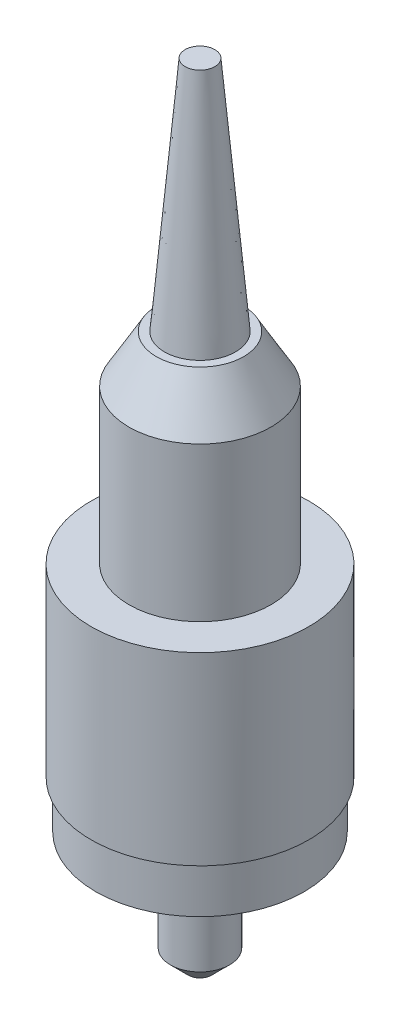
ISO-10303-21;
HEADER;
FILE_DESCRIPTION(('STEP AP214'),'2;1');
FILE_NAME('part.step','',(''),(''),'','','');
FILE_SCHEMA(('AUTOMOTIVE_DESIGN { 1 0 10303 214 1 1 1 1 }'));
ENDSEC;
DATA;
#1=APPLICATION_CONTEXT('core data for automotive mechanical design processes');
#2=APPLICATION_PROTOCOL_DEFINITION('international standard','automotive_design',2000,#1);
#3=PRODUCT_CONTEXT('',#1,'mechanical');
#4=PRODUCT('Part','Part','',(#3));
#5=PRODUCT_RELATED_PRODUCT_CATEGORY('part','',(#4));
#6=PRODUCT_DEFINITION_FORMATION('','',#4);
#7=PRODUCT_DEFINITION_CONTEXT('part definition',#1,'design');
#8=PRODUCT_DEFINITION('design','',#6,#7);
#9=PRODUCT_DEFINITION_SHAPE('','',#8);
#10=(LENGTH_UNIT() NAMED_UNIT(*) SI_UNIT(.MILLI.,.METRE.));
#11=(NAMED_UNIT(*) PLANE_ANGLE_UNIT() SI_UNIT($,.RADIAN.));
#12=(NAMED_UNIT(*) SI_UNIT($,.STERADIAN.) SOLID_ANGLE_UNIT());
#13=UNCERTAINTY_MEASURE_WITH_UNIT(LENGTH_MEASURE(1.E-05),#10,'distance_accuracy_value','');
#14=(GEOMETRIC_REPRESENTATION_CONTEXT(3) GLOBAL_UNCERTAINTY_ASSIGNED_CONTEXT((#13)) GLOBAL_UNIT_ASSIGNED_CONTEXT((#10,
#11,#12)) REPRESENTATION_CONTEXT('',''));
#15=CARTESIAN_POINT('',(0.,0.,0.));
#16=DIRECTION('',(0.,0.,1.));
#17=DIRECTION('',(1.,0.,0.));
#18=AXIS2_PLACEMENT_3D('',#15,#16,#17);
#19=CARTESIAN_POINT('',(0.,18.3,0.));
#20=DIRECTION('',(0.,1.,0.));
#21=DIRECTION('',(0.,0.,1.));
#22=AXIS2_PLACEMENT_3D('',#19,#20,#21);
#23=PLANE('',#22);
#24=CARTESIAN_POINT('',(0.,18.3,0.));
#25=DIRECTION('',(0.,1.,0.));
#26=DIRECTION('',(0.,0.,1.));
#27=AXIS2_PLACEMENT_3D('',#24,#25,#26);
#28=CIRCLE('',#27,1.84529946162074);
#29=CARTESIAN_POINT('',(0.,18.3,1.84529946162074));
#30=VERTEX_POINT('',#29);
#31=EDGE_CURVE('E44',#30,#30,#28,.T.);
#32=ORIENTED_EDGE('',*,*,#31,.T.);
#33=EDGE_LOOP('',(#32));
#34=FACE_BOUND('',#33,.T.);
#35=CARTESIAN_POINT('',(0.,18.3,0.));
#36=DIRECTION('',(0.,1.,0.));
#37=DIRECTION('',(0.,0.,1.));
#38=AXIS2_PLACEMENT_3D('',#35,#36,#37);
#39=CIRCLE('',#38,1.5);
#40=CARTESIAN_POINT('',(0.,18.3,1.5));
#41=VERTEX_POINT('',#40);
#42=EDGE_CURVE('E92',#41,#41,#39,.T.);
#43=ORIENTED_EDGE('',*,*,#42,.F.);
#44=EDGE_LOOP('',(#43));
#45=FACE_BOUND('',#44,.T.);
#46=ADVANCED_FACE('F33',(#34,#45),#23,.T.);
#47=CARTESIAN_POINT('',(0.,9.8,0.));
#48=DIRECTION('',(0.,1.,0.));
#49=DIRECTION('',(0.,0.,1.));
#50=AXIS2_PLACEMENT_3D('',#47,#48,#49);
#51=PLANE('',#50);
#52=CARTESIAN_POINT('',(0.,9.8,0.));
#53=DIRECTION('',(0.,1.,0.));
#54=DIRECTION('',(0.,0.,1.));
#55=AXIS2_PLACEMENT_3D('',#52,#53,#54);
#56=CIRCLE('',#55,4.6);
#57=CARTESIAN_POINT('',(0.,9.8,4.6));
#58=VERTEX_POINT('',#57);
#59=EDGE_CURVE('E56',#58,#58,#56,.T.);
#60=ORIENTED_EDGE('',*,*,#59,.T.);
#61=EDGE_LOOP('',(#60));
#62=FACE_BOUND('',#61,.T.);
#63=CARTESIAN_POINT('',(0.,9.8,0.));
#64=DIRECTION('',(0.,1.,0.));
#65=DIRECTION('',(0.,0.,1.));
#66=AXIS2_PLACEMENT_3D('',#63,#64,#65);
#67=CIRCLE('',#66,3.);
#68=CARTESIAN_POINT('',(0.,9.8,3.));
#69=VERTEX_POINT('',#68);
#70=EDGE_CURVE('E89',#69,#69,#67,.T.);
#71=ORIENTED_EDGE('',*,*,#70,.F.);
#72=EDGE_LOOP('',(#71));
#73=FACE_BOUND('',#72,.T.);
#74=ADVANCED_FACE('F100',(#62,#73),#51,.T.);
#75=CARTESIAN_POINT('',(0.,9.8,0.));
#76=DIRECTION('',(0.,-1.,0.));
#77=DIRECTION('',(0.,0.,-1.));
#78=AXIS2_PLACEMENT_3D('',#75,#76,#77);
#79=CYLINDRICAL_SURFACE('',#78,4.6);
#80=ORIENTED_EDGE('',*,*,#59,.F.);
#81=EDGE_LOOP('',(#80));
#82=FACE_BOUND('',#81,.T.);
#83=CARTESIAN_POINT('',(0.,2.,0.));
#84=DIRECTION('',(0.,-1.,0.));
#85=DIRECTION('',(0.,0.,-1.));
#86=AXIS2_PLACEMENT_3D('',#83,#84,#85);
#87=CIRCLE('',#86,4.6);
#88=CARTESIAN_POINT('',(0.,2.,-4.6));
#89=VERTEX_POINT('',#88);
#90=EDGE_CURVE('E59',#89,#89,#87,.T.);
#91=ORIENTED_EDGE('',*,*,#90,.F.);
#92=EDGE_LOOP('',(#91));
#93=FACE_BOUND('',#92,.T.);
#94=ADVANCED_FACE('F35',(#82,#93),#79,.T.);
#95=CARTESIAN_POINT('',(0.,2.,0.));
#96=DIRECTION('',(0.,-1.,0.));
#97=DIRECTION('',(0.,0.,-1.));
#98=AXIS2_PLACEMENT_3D('',#95,#96,#97);
#99=PLANE('',#98);
#100=CARTESIAN_POINT('',(0.,2.,0.));
#101=DIRECTION('',(0.,-1.,0.));
#102=DIRECTION('',(0.,0.,-1.));
#103=AXIS2_PLACEMENT_3D('',#100,#101,#102);
#104=CIRCLE('',#103,4.4);
#105=CARTESIAN_POINT('',(0.,2.,-4.4));
#106=VERTEX_POINT('',#105);
#107=EDGE_CURVE('E62',#106,#106,#104,.T.);
#108=ORIENTED_EDGE('',*,*,#107,.F.);
#109=EDGE_LOOP('',(#108));
#110=FACE_BOUND('',#109,.T.);
#111=ORIENTED_EDGE('',*,*,#90,.T.);
#112=EDGE_LOOP('',(#111));
#113=FACE_BOUND('',#112,.T.);
#114=ADVANCED_FACE('F154',(#110,#113),#99,.T.);
#115=CARTESIAN_POINT('',(0.,2.,0.));
#116=DIRECTION('',(0.,-1.,0.));
#117=DIRECTION('',(0.,0.,-1.));
#118=AXIS2_PLACEMENT_3D('',#115,#116,#117);
#119=CYLINDRICAL_SURFACE('',#118,4.4);
#120=ORIENTED_EDGE('',*,*,#107,.T.);
#121=EDGE_LOOP('',(#120));
#122=FACE_BOUND('',#121,.T.);
#123=CARTESIAN_POINT('',(0.,0.,0.));
#124=DIRECTION('',(0.,-1.,0.));
#125=DIRECTION('',(0.,0.,-1.));
#126=AXIS2_PLACEMENT_3D('',#123,#124,#125);
#127=CIRCLE('',#126,4.4);
#128=CARTESIAN_POINT('',(0.,0.,-4.4));
#129=VERTEX_POINT('',#128);
#130=EDGE_CURVE('E65',#129,#129,#127,.T.);
#131=ORIENTED_EDGE('',*,*,#130,.F.);
#132=EDGE_LOOP('',(#131));
#133=FACE_BOUND('',#132,.T.);
#134=ADVANCED_FACE('F151',(#122,#133),#119,.T.);
#135=CARTESIAN_POINT('',(0.,0.,0.));
#136=DIRECTION('',(0.,1.,0.));
#137=DIRECTION('',(0.,0.,1.));
#138=AXIS2_PLACEMENT_3D('',#135,#136,#137);
#139=PLANE('',#138);
#140=CARTESIAN_POINT('',(0.,0.,0.));
#141=DIRECTION('',(0.,-1.,0.));
#142=DIRECTION('',(0.,0.,-1.));
#143=AXIS2_PLACEMENT_3D('',#140,#141,#142);
#144=CIRCLE('',#143,3.9);
#145=CARTESIAN_POINT('',(0.,0.,-3.9));
#146=VERTEX_POINT('',#145);
#147=EDGE_CURVE('E71',#146,#146,#144,.T.);
#148=ORIENTED_EDGE('',*,*,#147,.F.);
#149=EDGE_LOOP('',(#148));
#150=FACE_BOUND('',#149,.T.);
#151=ORIENTED_EDGE('',*,*,#130,.T.);
#152=EDGE_LOOP('',(#151));
#153=FACE_BOUND('',#152,.T.);
#154=ADVANCED_FACE('F149',(#150,#153),#139,.F.);
#155=CARTESIAN_POINT('',(0.,4.,0.));
#156=DIRECTION('',(0.,-1.,0.));
#157=DIRECTION('',(0.,0.,-1.));
#158=AXIS2_PLACEMENT_3D('',#155,#156,#157);
#159=CYLINDRICAL_SURFACE('',#158,3.9);
#160=CARTESIAN_POINT('',(0.,4.,0.));
#161=DIRECTION('',(0.,-1.,0.));
#162=DIRECTION('',(0.,0.,-1.));
#163=AXIS2_PLACEMENT_3D('',#160,#161,#162);
#164=CIRCLE('',#163,3.9);
#165=CARTESIAN_POINT('',(0.,4.,-3.9));
#166=VERTEX_POINT('',#165);
#167=EDGE_CURVE('E68',#166,#166,#164,.T.);
#168=ORIENTED_EDGE('',*,*,#167,.F.);
#169=EDGE_LOOP('',(#168));
#170=FACE_BOUND('',#169,.T.);
#171=ORIENTED_EDGE('',*,*,#147,.T.);
#172=EDGE_LOOP('',(#171));
#173=FACE_BOUND('',#172,.T.);
#174=ADVANCED_FACE('F145',(#170,#173),#159,.F.);
#175=CARTESIAN_POINT('',(0.,4.,0.));
#176=DIRECTION('',(0.,-1.,0.));
#177=DIRECTION('',(0.,0.,-1.));
#178=AXIS2_PLACEMENT_3D('',#175,#176,#177);
#179=PLANE('',#178);
#180=CARTESIAN_POINT('',(0.,4.,0.));
#181=DIRECTION('',(0.,-1.,0.));
#182=DIRECTION('',(0.,0.,-1.));
#183=AXIS2_PLACEMENT_3D('',#180,#181,#182);
#184=CIRCLE('',#183,2.9);
#185=CARTESIAN_POINT('',(0.,4.,-2.9));
#186=VERTEX_POINT('',#185);
#187=EDGE_CURVE('E74',#186,#186,#184,.T.);
#188=ORIENTED_EDGE('',*,*,#187,.F.);
#189=EDGE_LOOP('',(#188));
#190=FACE_BOUND('',#189,.T.);
#191=ORIENTED_EDGE('',*,*,#167,.T.);
#192=EDGE_LOOP('',(#191));
#193=FACE_BOUND('',#192,.T.);
#194=ADVANCED_FACE('F141',(#190,#193),#179,.T.);
#195=CARTESIAN_POINT('',(0.,4.,0.));
#196=DIRECTION('',(0.,-1.,0.));
#197=DIRECTION('',(0.,0.,-1.));
#198=AXIS2_PLACEMENT_3D('',#195,#196,#197);
#199=CYLINDRICAL_SURFACE('',#198,2.9);
#200=ORIENTED_EDGE('',*,*,#187,.T.);
#201=EDGE_LOOP('',(#200));
#202=FACE_BOUND('',#201,.T.);
#203=CARTESIAN_POINT('',(0.,-1.,0.));
#204=DIRECTION('',(0.,-1.,0.));
#205=DIRECTION('',(0.,0.,-1.));
#206=AXIS2_PLACEMENT_3D('',#203,#204,#205);
#207=CIRCLE('',#206,2.9);
#208=CARTESIAN_POINT('',(0.,-1.,-2.9));
#209=VERTEX_POINT('',#208);
#210=EDGE_CURVE('E83',#209,#209,#207,.T.);
#211=ORIENTED_EDGE('',*,*,#210,.F.);
#212=EDGE_LOOP('',(#211));
#213=FACE_BOUND('',#212,.T.);
#214=ADVANCED_FACE('F119',(#202,#213),#199,.T.);
#215=CARTESIAN_POINT('',(0.,-1.,0.));
#216=DIRECTION('',(0.,-1.,0.));
#217=DIRECTION('',(0.,0.,-1.));
#218=AXIS2_PLACEMENT_3D('',#215,#216,#217);
#219=PLANE('',#218);
#220=ORIENTED_EDGE('',*,*,#210,.T.);
#221=EDGE_LOOP('',(#220));
#222=FACE_BOUND('',#221,.T.);
#223=CARTESIAN_POINT('',(0.,-1.,0.));
#224=DIRECTION('',(0.,-1.,0.));
#225=DIRECTION('',(0.,0.,-1.));
#226=AXIS2_PLACEMENT_3D('',#223,#224,#225);
#227=CIRCLE('',#226,2.4);
#228=CARTESIAN_POINT('',(0.,-1.,-2.4));
#229=VERTEX_POINT('',#228);
#230=EDGE_CURVE('E86',#229,#229,#227,.T.);
#231=ORIENTED_EDGE('',*,*,#230,.F.);
#232=EDGE_LOOP('',(#231));
#233=FACE_BOUND('',#232,.T.);
#234=ADVANCED_FACE('F115',(#222,#233),#219,.T.);
#235=CARTESIAN_POINT('',(0.,-5.,0.));
#236=DIRECTION('',(0.,-1.,0.));
#237=DIRECTION('',(0.,0.,-1.));
#238=AXIS2_PLACEMENT_3D('',#235,#236,#237);
#239=PLANE('',#238);
#240=CARTESIAN_POINT('',(0.,-5.,0.));
#241=DIRECTION('',(0.,-1.,0.));
#242=DIRECTION('',(0.,0.,-1.));
#243=AXIS2_PLACEMENT_3D('',#240,#241,#242);
#244=CIRCLE('',#243,0.5);
#245=CARTESIAN_POINT('',(0.,-5.,-0.5));
#246=VERTEX_POINT('',#245);
#247=EDGE_CURVE('E53',#246,#246,#244,.T.);
#248=ORIENTED_EDGE('',*,*,#247,.T.);
#249=EDGE_LOOP('',(#248));
#250=FACE_BOUND('',#249,.T.);
#251=ADVANCED_FACE('F118',(#250),#239,.T.);
#252=CARTESIAN_POINT('',(0.,-5.,0.));
#253=DIRECTION('',(0.,1.,0.));
#254=DIRECTION('',(0.,0.,1.));
#255=AXIS2_PLACEMENT_3D('',#252,#253,#254);
#256=CONICAL_SURFACE('',#255,0.5,0.785398163397445);
#257=CARTESIAN_POINT('',(0.,-4.25,0.));
#258=DIRECTION('',(0.,-1.,0.));
#259=DIRECTION('',(0.,0.,-1.));
#260=AXIS2_PLACEMENT_3D('',#257,#258,#259);
#261=CIRCLE('',#260,1.25);
#262=CARTESIAN_POINT('',(0.,-4.25,-1.25));
#263=VERTEX_POINT('',#262);
#264=EDGE_CURVE('E48',#263,#263,#261,.F.);
#265=ORIENTED_EDGE('',*,*,#264,.F.);
#266=EDGE_LOOP('',(#265));
#267=FACE_BOUND('',#266,.T.);
#268=ORIENTED_EDGE('',*,*,#247,.F.);
#269=EDGE_LOOP('',(#268));
#270=FACE_BOUND('',#269,.T.);
#271=ADVANCED_FACE('F121',(#267,#270),#256,.T.);
#272=CARTESIAN_POINT('',(0.,-5.,0.));
#273=DIRECTION('',(0.,1.,0.));
#274=DIRECTION('',(0.,0.,1.));
#275=AXIS2_PLACEMENT_3D('',#272,#273,#274);
#276=CYLINDRICAL_SURFACE('',#275,1.25);
#277=ORIENTED_EDGE('',*,*,#264,.T.);
#278=EDGE_LOOP('',(#277));
#279=FACE_BOUND('',#278,.T.);
#280=CARTESIAN_POINT('',(0.,5.,0.));
#281=DIRECTION('',(0.,-1.,0.));
#282=DIRECTION('',(0.,0.,-1.));
#283=AXIS2_PLACEMENT_3D('',#280,#281,#282);
#284=CIRCLE('',#283,1.25);
#285=CARTESIAN_POINT('',(0.,5.,-1.25));
#286=VERTEX_POINT('',#285);
#287=EDGE_CURVE('E80',#286,#286,#284,.T.);
#288=ORIENTED_EDGE('',*,*,#287,.T.);
#289=EDGE_LOOP('',(#288));
#290=FACE_BOUND('',#289,.T.);
#291=ADVANCED_FACE('F124',(#279,#290),#276,.T.);
#292=CARTESIAN_POINT('',(0.,5.,0.));
#293=DIRECTION('',(0.,-1.,0.));
#294=DIRECTION('',(0.,0.,-1.));
#295=AXIS2_PLACEMENT_3D('',#292,#293,#294);
#296=PLANE('',#295);
#297=CARTESIAN_POINT('',(0.,5.,0.));
#298=DIRECTION('',(0.,-1.,0.));
#299=DIRECTION('',(0.,0.,-1.));
#300=AXIS2_PLACEMENT_3D('',#297,#298,#299);
#301=CIRCLE('',#300,2.4);
#302=CARTESIAN_POINT('',(0.,5.,-2.4));
#303=VERTEX_POINT('',#302);
#304=EDGE_CURVE('E77',#303,#303,#301,.T.);
#305=ORIENTED_EDGE('',*,*,#304,.T.);
#306=EDGE_LOOP('',(#305));
#307=FACE_BOUND('',#306,.T.);
#308=ORIENTED_EDGE('',*,*,#287,.F.);
#309=EDGE_LOOP('',(#308));
#310=FACE_BOUND('',#309,.T.);
#311=ADVANCED_FACE('F131',(#307,#310),#296,.T.);
#312=CARTESIAN_POINT('',(0.,5.,0.));
#313=DIRECTION('',(0.,-1.,0.));
#314=DIRECTION('',(0.,0.,-1.));
#315=AXIS2_PLACEMENT_3D('',#312,#313,#314);
#316=CYLINDRICAL_SURFACE('',#315,2.4);
#317=ORIENTED_EDGE('',*,*,#304,.F.);
#318=EDGE_LOOP('',(#317));
#319=FACE_BOUND('',#318,.T.);
#320=ORIENTED_EDGE('',*,*,#230,.T.);
#321=EDGE_LOOP('',(#320));
#322=FACE_BOUND('',#321,.T.);
#323=ADVANCED_FACE('F114',(#319,#322),#316,.F.);
#324=CARTESIAN_POINT('',(0.,18.3,0.));
#325=DIRECTION('',(0.,-1.,0.));
#326=DIRECTION('',(0.,0.,-1.));
#327=AXIS2_PLACEMENT_3D('',#324,#325,#326);
#328=CYLINDRICAL_SURFACE('',#327,3.);
#329=CARTESIAN_POINT('',(0.,16.3,0.));
#330=DIRECTION('',(0.,1.,0.));
#331=DIRECTION('',(0.,0.,1.));
#332=AXIS2_PLACEMENT_3D('',#329,#330,#331);
#333=CIRCLE('',#332,3.);
#334=CARTESIAN_POINT('',(0.,16.3,3.));
#335=VERTEX_POINT('',#334);
#336=EDGE_CURVE('E40',#335,#335,#333,.F.);
#337=ORIENTED_EDGE('',*,*,#336,.T.);
#338=EDGE_LOOP('',(#337));
#339=FACE_BOUND('',#338,.T.);
#340=ORIENTED_EDGE('',*,*,#70,.T.);
#341=EDGE_LOOP('',(#340));
#342=FACE_BOUND('',#341,.T.);
#343=ADVANCED_FACE('F111',(#339,#342),#328,.T.);
#344=CARTESIAN_POINT('',(0.,18.3,0.));
#345=DIRECTION('',(0.,-1.,0.));
#346=DIRECTION('',(0.,0.,-1.));
#347=AXIS2_PLACEMENT_3D('',#344,#345,#346);
#348=CONICAL_SURFACE('',#347,1.84529946162074,0.523598775598297);
#349=ORIENTED_EDGE('',*,*,#336,.F.);
#350=EDGE_LOOP('',(#349));
#351=FACE_BOUND('',#350,.T.);
#352=ORIENTED_EDGE('',*,*,#31,.F.);
#353=EDGE_LOOP('',(#352));
#354=FACE_BOUND('',#353,.T.);
#355=ADVANCED_FACE('F109',(#351,#354),#348,.T.);
#356=CARTESIAN_POINT('',(0.,28.3,0.));
#357=DIRECTION('',(0.,1.,0.));
#358=DIRECTION('',(0.,0.,1.));
#359=AXIS2_PLACEMENT_3D('',#356,#357,#358);
#360=PLANE('',#359);
#361=CARTESIAN_POINT('',(0.,28.3,0.));
#362=DIRECTION('',(0.,1.,0.));
#363=DIRECTION('',(0.,0.,1.));
#364=AXIS2_PLACEMENT_3D('',#361,#362,#363);
#365=CIRCLE('',#364,0.625113364740746);
#366=CARTESIAN_POINT('',(0.,28.3,0.625113364740746));
#367=VERTEX_POINT('',#366);
#368=EDGE_CURVE('E10',#367,#367,#365,.T.);
#369=ORIENTED_EDGE('',*,*,#368,.T.);
#370=EDGE_LOOP('',(#369));
#371=FACE_BOUND('',#370,.T.);
#372=ADVANCED_FACE('F217',(#371),#360,.T.);
#373=CARTESIAN_POINT('',(0.,28.3,0.));
#374=DIRECTION('',(0.,-1.,0.));
#375=DIRECTION('',(0.,0.,-1.));
#376=AXIS2_PLACEMENT_3D('',#373,#374,#375);
#377=CONICAL_SURFACE('',#376,0.625113364740746,0.0872664625997133);
#378=ORIENTED_EDGE('',*,*,#42,.T.);
#379=EDGE_LOOP('',(#378));
#380=FACE_BOUND('',#379,.T.);
#381=ORIENTED_EDGE('',*,*,#368,.F.);
#382=EDGE_LOOP('',(#381));
#383=FACE_BOUND('',#382,.T.);
#384=ADVANCED_FACE('F96',(#380,#383),#377,.T.);
#385=CLOSED_SHELL('',(#46,#74,#94,#114,#134,#154,#174,#194,#214,#234,#251,#271,#291,#311,#323,
#343,#355,#372,#384));
#386=MANIFOLD_SOLID_BREP('B2',#385);
#387=ADVANCED_BREP_SHAPE_REPRESENTATION('',(#18,#386),#14);
#388=SHAPE_DEFINITION_REPRESENTATION(#9,#387);
ENDSEC;
END-ISO-10303-21;
